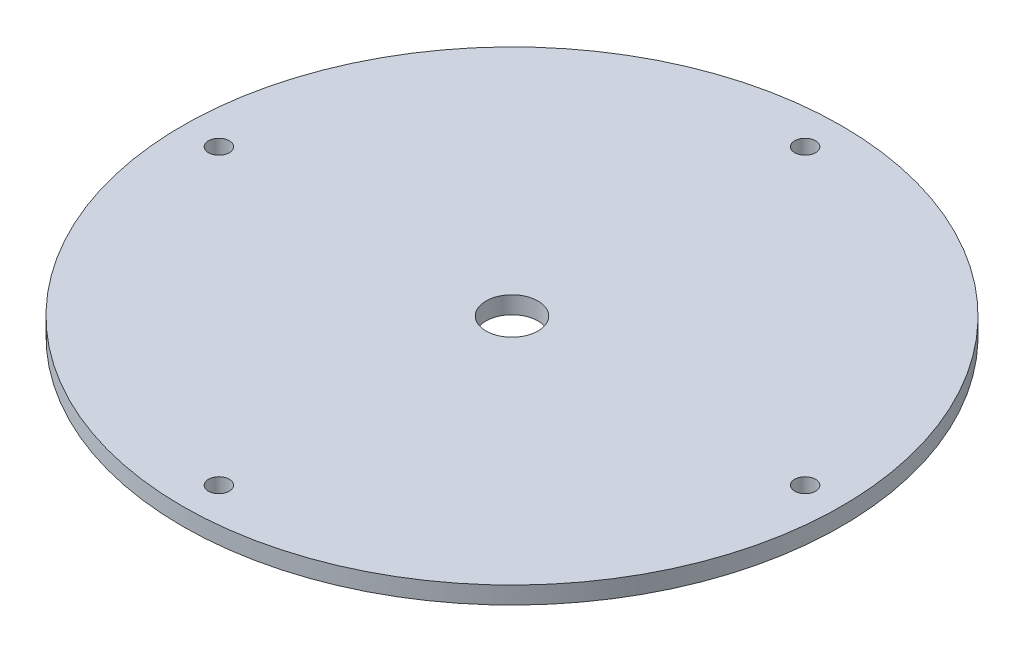
ISO-10303-21;
HEADER;
FILE_DESCRIPTION(('STEP AP214'),'2;1');
FILE_NAME('part.step','',(''),(''),'','','');
FILE_SCHEMA(('AUTOMOTIVE_DESIGN { 1 0 10303 214 1 1 1 1 }'));
ENDSEC;
DATA;
#1=APPLICATION_CONTEXT('core data for automotive mechanical design processes');
#2=APPLICATION_PROTOCOL_DEFINITION('international standard','automotive_design',2000,#1);
#3=PRODUCT_CONTEXT('',#1,'mechanical');
#4=PRODUCT('Part','Part','',(#3));
#5=PRODUCT_RELATED_PRODUCT_CATEGORY('part','',(#4));
#6=PRODUCT_DEFINITION_FORMATION('','',#4);
#7=PRODUCT_DEFINITION_CONTEXT('part definition',#1,'design');
#8=PRODUCT_DEFINITION('design','',#6,#7);
#9=PRODUCT_DEFINITION_SHAPE('','',#8);
#10=(LENGTH_UNIT() NAMED_UNIT(*) SI_UNIT(.MILLI.,.METRE.));
#11=(NAMED_UNIT(*) PLANE_ANGLE_UNIT() SI_UNIT($,.RADIAN.));
#12=(NAMED_UNIT(*) SI_UNIT($,.STERADIAN.) SOLID_ANGLE_UNIT());
#13=UNCERTAINTY_MEASURE_WITH_UNIT(LENGTH_MEASURE(1.E-05),#10,'distance_accuracy_value','');
#14=(GEOMETRIC_REPRESENTATION_CONTEXT(3) GLOBAL_UNCERTAINTY_ASSIGNED_CONTEXT((#13)) GLOBAL_UNIT_ASSIGNED_CONTEXT((#10,
#11,#12)) REPRESENTATION_CONTEXT('',''));
#15=CARTESIAN_POINT('',(0.,0.,0.));
#16=DIRECTION('',(0.,0.,1.));
#17=DIRECTION('',(1.,0.,0.));
#18=AXIS2_PLACEMENT_3D('',#15,#16,#17);
#19=CARTESIAN_POINT('',(0.,5.,0.));
#20=DIRECTION('',(0.,1.,0.));
#21=DIRECTION('',(0.,0.,1.));
#22=AXIS2_PLACEMENT_3D('',#19,#20,#21);
#23=PLANE('',#22);
#24=CARTESIAN_POINT('',(0.,5.,84.5));
#25=DIRECTION('',(0.,1.,0.));
#26=DIRECTION('',(0.,0.,1.));
#27=AXIS2_PLACEMENT_3D('',#24,#25,#26);
#28=CIRCLE('',#27,3.);
#29=CARTESIAN_POINT('',(0.,5.,87.5));
#30=VERTEX_POINT('',#29);
#31=EDGE_CURVE('E73',#30,#30,#28,.T.);
#32=ORIENTED_EDGE('',*,*,#31,.F.);
#33=EDGE_LOOP('',(#32));
#34=FACE_BOUND('',#33,.T.);
#35=CARTESIAN_POINT('',(0.,5.,-84.5));
#36=DIRECTION('',(0.,1.,0.));
#37=DIRECTION('',(0.,0.,1.));
#38=AXIS2_PLACEMENT_3D('',#35,#36,#37);
#39=CIRCLE('',#38,3.);
#40=CARTESIAN_POINT('',(0.,5.,-81.5));
#41=VERTEX_POINT('',#40);
#42=EDGE_CURVE('E61',#41,#41,#39,.T.);
#43=ORIENTED_EDGE('',*,*,#42,.F.);
#44=EDGE_LOOP('',(#43));
#45=FACE_BOUND('',#44,.T.);
#46=CARTESIAN_POINT('',(0.,5.,0.));
#47=DIRECTION('',(0.,1.,0.));
#48=DIRECTION('',(0.,0.,1.));
#49=AXIS2_PLACEMENT_3D('',#46,#47,#48);
#50=CIRCLE('',#49,95.);
#51=CARTESIAN_POINT('',(0.,5.,95.));
#52=VERTEX_POINT('',#51);
#53=EDGE_CURVE('E10',#52,#52,#50,.T.);
#54=ORIENTED_EDGE('',*,*,#53,.T.);
#55=EDGE_LOOP('',(#54));
#56=FACE_BOUND('',#55,.T.);
#57=CARTESIAN_POINT('',(0.,5.,0.));
#58=DIRECTION('',(0.,1.,0.));
#59=DIRECTION('',(0.,0.,1.));
#60=AXIS2_PLACEMENT_3D('',#57,#58,#59);
#61=CIRCLE('',#60,7.5);
#62=CARTESIAN_POINT('',(0.,5.,7.5));
#63=VERTEX_POINT('',#62);
#64=EDGE_CURVE('E55',#63,#63,#61,.T.);
#65=ORIENTED_EDGE('',*,*,#64,.F.);
#66=EDGE_LOOP('',(#65));
#67=FACE_BOUND('',#66,.T.);
#68=CARTESIAN_POINT('',(84.5,5.,0.));
#69=DIRECTION('',(0.,1.,0.));
#70=DIRECTION('',(0.,0.,1.));
#71=AXIS2_PLACEMENT_3D('',#68,#69,#70);
#72=CIRCLE('',#71,3.00000000000001);
#73=CARTESIAN_POINT('',(84.5,5.,3.));
#74=VERTEX_POINT('',#73);
#75=EDGE_CURVE('E67',#74,#74,#72,.T.);
#76=ORIENTED_EDGE('',*,*,#75,.F.);
#77=EDGE_LOOP('',(#76));
#78=FACE_BOUND('',#77,.T.);
#79=CARTESIAN_POINT('',(-84.5,5.,0.));
#80=DIRECTION('',(0.,1.,0.));
#81=DIRECTION('',(0.,0.,1.));
#82=AXIS2_PLACEMENT_3D('',#79,#80,#81);
#83=CIRCLE('',#82,3.00000000000001);
#84=CARTESIAN_POINT('',(-84.5,5.,3.00000000000002));
#85=VERTEX_POINT('',#84);
#86=EDGE_CURVE('E79',#85,#85,#83,.T.);
#87=ORIENTED_EDGE('',*,*,#86,.F.);
#88=EDGE_LOOP('',(#87));
#89=FACE_BOUND('',#88,.T.);
#90=ADVANCED_FACE('F43',(#34,#45,#56,#67,#78,#89),#23,.T.);
#91=CARTESIAN_POINT('',(0.,0.,0.));
#92=DIRECTION('',(0.,1.,0.));
#93=DIRECTION('',(0.,0.,1.));
#94=AXIS2_PLACEMENT_3D('',#91,#92,#93);
#95=PLANE('',#94);
#96=CARTESIAN_POINT('',(0.,0.,0.));
#97=DIRECTION('',(0.,1.,0.));
#98=DIRECTION('',(0.,0.,1.));
#99=AXIS2_PLACEMENT_3D('',#96,#97,#98);
#100=CIRCLE('',#99,95.);
#101=CARTESIAN_POINT('',(0.,0.,95.));
#102=VERTEX_POINT('',#101);
#103=EDGE_CURVE('E47',#102,#102,#100,.T.);
#104=ORIENTED_EDGE('',*,*,#103,.F.);
#105=EDGE_LOOP('',(#104));
#106=FACE_BOUND('',#105,.T.);
#107=CARTESIAN_POINT('',(0.,0.,0.));
#108=DIRECTION('',(0.,1.,0.));
#109=DIRECTION('',(0.,0.,1.));
#110=AXIS2_PLACEMENT_3D('',#107,#108,#109);
#111=CIRCLE('',#110,7.5);
#112=CARTESIAN_POINT('',(0.,0.,7.5));
#113=VERTEX_POINT('',#112);
#114=EDGE_CURVE('E57',#113,#113,#111,.T.);
#115=ORIENTED_EDGE('',*,*,#114,.T.);
#116=EDGE_LOOP('',(#115));
#117=FACE_BOUND('',#116,.T.);
#118=CARTESIAN_POINT('',(0.,0.,-84.5));
#119=DIRECTION('',(0.,1.,0.));
#120=DIRECTION('',(0.,0.,1.));
#121=AXIS2_PLACEMENT_3D('',#118,#119,#120);
#122=CIRCLE('',#121,3.);
#123=CARTESIAN_POINT('',(0.,0.,-81.5));
#124=VERTEX_POINT('',#123);
#125=EDGE_CURVE('E64',#124,#124,#122,.T.);
#126=ORIENTED_EDGE('',*,*,#125,.T.);
#127=EDGE_LOOP('',(#126));
#128=FACE_BOUND('',#127,.T.);
#129=CARTESIAN_POINT('',(84.5,0.,0.));
#130=DIRECTION('',(0.,1.,0.));
#131=DIRECTION('',(0.,0.,1.));
#132=AXIS2_PLACEMENT_3D('',#129,#130,#131);
#133=CIRCLE('',#132,3.00000000000001);
#134=CARTESIAN_POINT('',(84.5,0.,3.));
#135=VERTEX_POINT('',#134);
#136=EDGE_CURVE('E70',#135,#135,#133,.T.);
#137=ORIENTED_EDGE('',*,*,#136,.T.);
#138=EDGE_LOOP('',(#137));
#139=FACE_BOUND('',#138,.T.);
#140=CARTESIAN_POINT('',(0.,0.,84.5));
#141=DIRECTION('',(0.,1.,0.));
#142=DIRECTION('',(0.,0.,1.));
#143=AXIS2_PLACEMENT_3D('',#140,#141,#142);
#144=CIRCLE('',#143,3.);
#145=CARTESIAN_POINT('',(0.,0.,87.5));
#146=VERTEX_POINT('',#145);
#147=EDGE_CURVE('E76',#146,#146,#144,.T.);
#148=ORIENTED_EDGE('',*,*,#147,.T.);
#149=EDGE_LOOP('',(#148));
#150=FACE_BOUND('',#149,.T.);
#151=CARTESIAN_POINT('',(-84.5,0.,0.));
#152=DIRECTION('',(0.,1.,0.));
#153=DIRECTION('',(0.,0.,1.));
#154=AXIS2_PLACEMENT_3D('',#151,#152,#153);
#155=CIRCLE('',#154,3.00000000000001);
#156=CARTESIAN_POINT('',(-84.5,0.,3.00000000000002));
#157=VERTEX_POINT('',#156);
#158=EDGE_CURVE('E82',#157,#157,#155,.T.);
#159=ORIENTED_EDGE('',*,*,#158,.T.);
#160=EDGE_LOOP('',(#159));
#161=FACE_BOUND('',#160,.T.);
#162=ADVANCED_FACE('F92',(#106,#117,#128,#139,#150,#161),#95,.F.);
#163=CARTESIAN_POINT('',(0.,5.,0.));
#164=DIRECTION('',(0.,-1.,0.));
#165=DIRECTION('',(0.,0.,-1.));
#166=AXIS2_PLACEMENT_3D('',#163,#164,#165);
#167=CYLINDRICAL_SURFACE('',#166,95.);
#168=ORIENTED_EDGE('',*,*,#53,.F.);
#169=EDGE_LOOP('',(#168));
#170=FACE_BOUND('',#169,.T.);
#171=ORIENTED_EDGE('',*,*,#103,.T.);
#172=EDGE_LOOP('',(#171));
#173=FACE_BOUND('',#172,.T.);
#174=ADVANCED_FACE('F45',(#170,#173),#167,.T.);
#175=CARTESIAN_POINT('',(0.,5.,0.));
#176=DIRECTION('',(0.,-1.,0.));
#177=DIRECTION('',(0.,0.,-1.));
#178=AXIS2_PLACEMENT_3D('',#175,#176,#177);
#179=CYLINDRICAL_SURFACE('',#178,7.5);
#180=ORIENTED_EDGE('',*,*,#64,.T.);
#181=EDGE_LOOP('',(#180));
#182=FACE_BOUND('',#181,.T.);
#183=ORIENTED_EDGE('',*,*,#114,.F.);
#184=EDGE_LOOP('',(#183));
#185=FACE_BOUND('',#184,.T.);
#186=ADVANCED_FACE('F102',(#182,#185),#179,.F.);
#187=CARTESIAN_POINT('',(0.,5.,-84.5));
#188=DIRECTION('',(0.,-1.,0.));
#189=DIRECTION('',(0.,0.,-1.));
#190=AXIS2_PLACEMENT_3D('',#187,#188,#189);
#191=CYLINDRICAL_SURFACE('',#190,3.);
#192=ORIENTED_EDGE('',*,*,#42,.T.);
#193=EDGE_LOOP('',(#192));
#194=FACE_BOUND('',#193,.T.);
#195=ORIENTED_EDGE('',*,*,#125,.F.);
#196=EDGE_LOOP('',(#195));
#197=FACE_BOUND('',#196,.T.);
#198=ADVANCED_FACE('F105',(#194,#197),#191,.F.);
#199=CARTESIAN_POINT('',(84.5,5.,0.));
#200=DIRECTION('',(0.,-1.,0.));
#201=DIRECTION('',(0.,0.,-1.));
#202=AXIS2_PLACEMENT_3D('',#199,#200,#201);
#203=CYLINDRICAL_SURFACE('',#202,3.00000000000001);
#204=ORIENTED_EDGE('',*,*,#75,.T.);
#205=EDGE_LOOP('',(#204));
#206=FACE_BOUND('',#205,.T.);
#207=ORIENTED_EDGE('',*,*,#136,.F.);
#208=EDGE_LOOP('',(#207));
#209=FACE_BOUND('',#208,.T.);
#210=ADVANCED_FACE('F109',(#206,#209),#203,.F.);
#211=CARTESIAN_POINT('',(0.,5.,84.5));
#212=DIRECTION('',(0.,-1.,0.));
#213=DIRECTION('',(0.,0.,-1.));
#214=AXIS2_PLACEMENT_3D('',#211,#212,#213);
#215=CYLINDRICAL_SURFACE('',#214,3.);
#216=ORIENTED_EDGE('',*,*,#31,.T.);
#217=EDGE_LOOP('',(#216));
#218=FACE_BOUND('',#217,.T.);
#219=ORIENTED_EDGE('',*,*,#147,.F.);
#220=EDGE_LOOP('',(#219));
#221=FACE_BOUND('',#220,.T.);
#222=ADVANCED_FACE('F113',(#218,#221),#215,.F.);
#223=CARTESIAN_POINT('',(-84.5,5.,0.));
#224=DIRECTION('',(0.,-1.,0.));
#225=DIRECTION('',(0.,0.,-1.));
#226=AXIS2_PLACEMENT_3D('',#223,#224,#225);
#227=CYLINDRICAL_SURFACE('',#226,3.00000000000001);
#228=ORIENTED_EDGE('',*,*,#86,.T.);
#229=EDGE_LOOP('',(#228));
#230=FACE_BOUND('',#229,.T.);
#231=ORIENTED_EDGE('',*,*,#158,.F.);
#232=EDGE_LOOP('',(#231));
#233=FACE_BOUND('',#232,.T.);
#234=ADVANCED_FACE('F88',(#230,#233),#227,.F.);
#235=CLOSED_SHELL('',(#90,#162,#174,#186,#198,#210,#222,#234));
#236=MANIFOLD_SOLID_BREP('B2',#235);
#237=ADVANCED_BREP_SHAPE_REPRESENTATION('',(#18,#236),#14);
#238=SHAPE_DEFINITION_REPRESENTATION(#9,#237);
ENDSEC;
END-ISO-10303-21;
